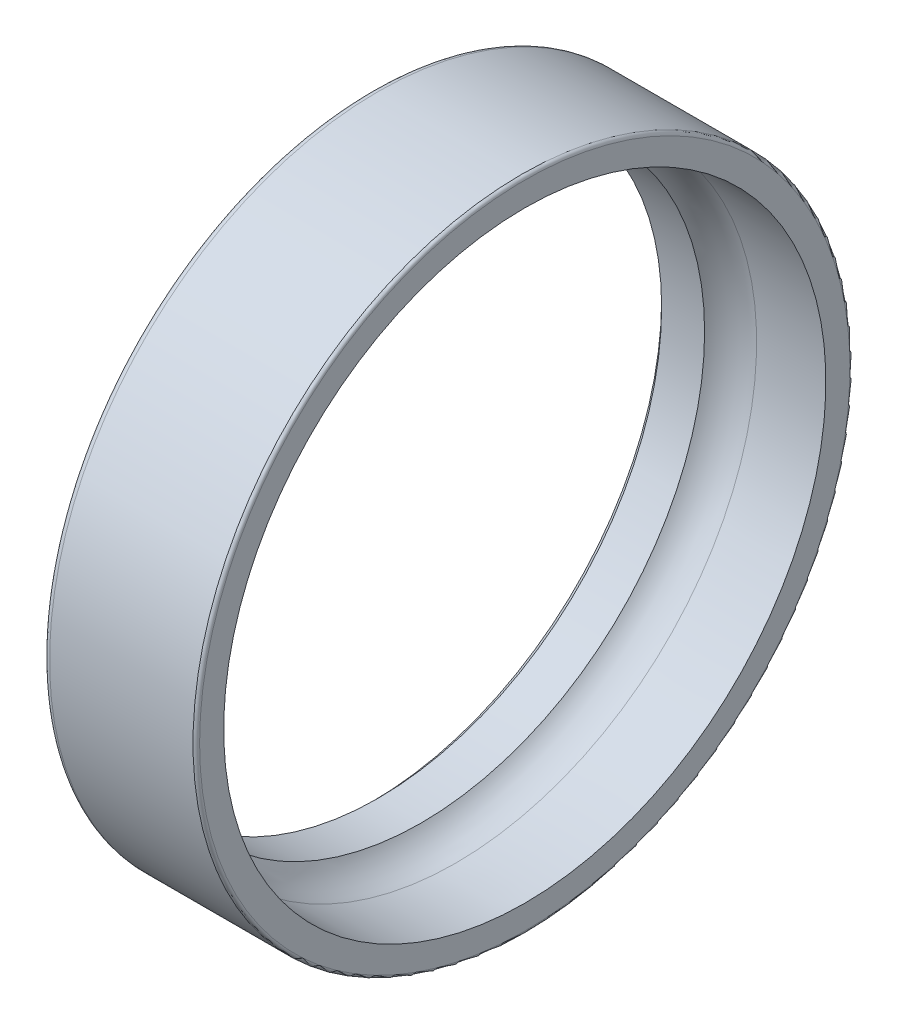
ISO-10303-21;
HEADER;
FILE_DESCRIPTION(('STEP AP214'),'2;1');
FILE_NAME('part.step','',(''),(''),'','','');
FILE_SCHEMA(('AUTOMOTIVE_DESIGN { 1 0 10303 214 1 1 1 1 }'));
ENDSEC;
DATA;
#1=APPLICATION_CONTEXT('core data for automotive mechanical design processes');
#2=APPLICATION_PROTOCOL_DEFINITION('international standard','automotive_design',2000,#1);
#3=PRODUCT_CONTEXT('',#1,'mechanical');
#4=PRODUCT('Part','Part','',(#3));
#5=PRODUCT_RELATED_PRODUCT_CATEGORY('part','',(#4));
#6=PRODUCT_DEFINITION_FORMATION('','',#4);
#7=PRODUCT_DEFINITION_CONTEXT('part definition',#1,'design');
#8=PRODUCT_DEFINITION('design','',#6,#7);
#9=PRODUCT_DEFINITION_SHAPE('','',#8);
#10=(LENGTH_UNIT() NAMED_UNIT(*) SI_UNIT(.MILLI.,.METRE.));
#11=(NAMED_UNIT(*) PLANE_ANGLE_UNIT() SI_UNIT($,.RADIAN.));
#12=(NAMED_UNIT(*) SI_UNIT($,.STERADIAN.) SOLID_ANGLE_UNIT());
#13=UNCERTAINTY_MEASURE_WITH_UNIT(LENGTH_MEASURE(1.E-05),#10,'distance_accuracy_value','');
#14=(GEOMETRIC_REPRESENTATION_CONTEXT(3) GLOBAL_UNCERTAINTY_ASSIGNED_CONTEXT((#13)) GLOBAL_UNIT_ASSIGNED_CONTEXT((#10,
#11,#12)) REPRESENTATION_CONTEXT('',''));
#15=CARTESIAN_POINT('',(0.,0.,0.));
#16=DIRECTION('',(0.,0.,1.));
#17=DIRECTION('',(1.,0.,0.));
#18=AXIS2_PLACEMENT_3D('',#15,#16,#17);
#19=CARTESIAN_POINT('',(0.,13.975,0.));
#20=DIRECTION('',(-1.,0.,0.));
#21=DIRECTION('',(0.,1.,0.));
#22=AXIS2_PLACEMENT_3D('',#19,#20,#21);
#23=PLANE('',#22);
#24=CARTESIAN_POINT('',(0.,0.,0.));
#25=DIRECTION('',(1.,0.,0.));
#26=DIRECTION('',(0.,1.,0.));
#27=AXIS2_PLACEMENT_3D('',#24,#25,#26);
#28=CIRCLE('',#27,13.25);
#29=CARTESIAN_POINT('',(0.,-13.25,0.));
#30=VERTEX_POINT('',#29);
#31=EDGE_CURVE('E90',#30,#30,#28,.T.);
#32=ORIENTED_EDGE('',*,*,#31,.T.);
#33=EDGE_LOOP('',(#32));
#34=FACE_BOUND('',#33,.T.);
#35=CARTESIAN_POINT('',(0.,0.,0.));
#36=DIRECTION('',(1.,0.,0.));
#37=DIRECTION('',(0.,1.,0.));
#38=AXIS2_PLACEMENT_3D('',#35,#36,#37);
#39=CIRCLE('',#38,14.7);
#40=CARTESIAN_POINT('',(0.,0.,14.7));
#41=VERTEX_POINT('',#40);
#42=EDGE_CURVE('E70',#41,#41,#39,.T.);
#43=ORIENTED_EDGE('',*,*,#42,.F.);
#44=EDGE_LOOP('',(#43));
#45=FACE_BOUND('',#44,.T.);
#46=ADVANCED_FACE('F17',(#34,#45),#23,.T.);
#47=CARTESIAN_POINT('',(7.,14.3,0.));
#48=DIRECTION('',(1.,0.,0.));
#49=DIRECTION('',(0.,1.,0.));
#50=AXIS2_PLACEMENT_3D('',#47,#48,#49);
#51=PLANE('',#50);
#52=CARTESIAN_POINT('',(7.,0.,0.));
#53=DIRECTION('',(1.,0.,0.));
#54=DIRECTION('',(0.,1.,0.));
#55=AXIS2_PLACEMENT_3D('',#52,#53,#54);
#56=CIRCLE('',#55,13.75);
#57=CARTESIAN_POINT('',(7.,-13.75,0.));
#58=VERTEX_POINT('',#57);
#59=EDGE_CURVE('E21',#58,#58,#56,.T.);
#60=ORIENTED_EDGE('',*,*,#59,.F.);
#61=EDGE_LOOP('',(#60));
#62=FACE_BOUND('',#61,.T.);
#63=CARTESIAN_POINT('',(7.,0.,0.));
#64=DIRECTION('',(1.,0.,0.));
#65=DIRECTION('',(0.,1.,0.));
#66=AXIS2_PLACEMENT_3D('',#63,#64,#65);
#67=CIRCLE('',#66,14.85);
#68=CARTESIAN_POINT('',(7.,0.,14.85));
#69=VERTEX_POINT('',#68);
#70=EDGE_CURVE('E27',#69,#69,#67,.T.);
#71=ORIENTED_EDGE('',*,*,#70,.T.);
#72=EDGE_LOOP('',(#71));
#73=FACE_BOUND('',#72,.T.);
#74=ADVANCED_FACE('F121',(#62,#73),#51,.T.);
#75=CARTESIAN_POINT('',(3.575,0.,0.));
#76=DIRECTION('',(1.,0.,0.));
#77=DIRECTION('',(0.,1.,0.));
#78=AXIS2_PLACEMENT_3D('',#75,#76,#77);
#79=CYLINDRICAL_SURFACE('',#78,15.);
#80=CARTESIAN_POINT('',(0.3,0.,0.));
#81=DIRECTION('',(1.,0.,0.));
#82=DIRECTION('',(0.,1.,0.));
#83=AXIS2_PLACEMENT_3D('',#80,#81,#82);
#84=CIRCLE('',#83,15.);
#85=CARTESIAN_POINT('',(0.3,-15.,0.));
#86=VERTEX_POINT('',#85);
#87=EDGE_CURVE('E61',#86,#86,#84,.T.);
#88=ORIENTED_EDGE('',*,*,#87,.T.);
#89=EDGE_LOOP('',(#88));
#90=FACE_BOUND('',#89,.T.);
#91=CARTESIAN_POINT('',(6.85,0.,0.));
#92=DIRECTION('',(1.,0.,0.));
#93=DIRECTION('',(0.,1.,0.));
#94=AXIS2_PLACEMENT_3D('',#91,#92,#93);
#95=CIRCLE('',#94,15.);
#96=CARTESIAN_POINT('',(6.85,-15.,0.));
#97=VERTEX_POINT('',#96);
#98=EDGE_CURVE('E11',#97,#97,#95,.T.);
#99=ORIENTED_EDGE('',*,*,#98,.F.);
#100=EDGE_LOOP('',(#99));
#101=FACE_BOUND('',#100,.T.);
#102=ADVANCED_FACE('F127',(#90,#101),#79,.T.);
#103=CARTESIAN_POINT('',(6.85,0.,0.));
#104=DIRECTION('',(1.,0.,0.));
#105=DIRECTION('',(0.,0.,-1.));
#106=AXIS2_PLACEMENT_3D('',#103,#104,#105);
#107=TOROIDAL_SURFACE('',#106,14.85,0.15);
#108=ORIENTED_EDGE('',*,*,#98,.T.);
#109=EDGE_LOOP('',(#108));
#110=FACE_BOUND('',#109,.T.);
#111=ORIENTED_EDGE('',*,*,#70,.F.);
#112=EDGE_LOOP('',(#111));
#113=FACE_BOUND('',#112,.T.);
#114=ADVANCED_FACE('F118',(#110,#113),#107,.T.);
#115=CARTESIAN_POINT('',(5.42245673247465,0.,0.));
#116=DIRECTION('',(1.,0.,0.));
#117=DIRECTION('',(0.,1.,0.));
#118=AXIS2_PLACEMENT_3D('',#115,#116,#117);
#119=CONICAL_SURFACE('',#118,13.7464975544884,0.00222018617740625);
#120=CARTESIAN_POINT('',(3.84491346494929,0.,0.));
#121=DIRECTION('',(1.,0.,0.));
#122=DIRECTION('',(0.,1.,0.));
#123=AXIS2_PLACEMENT_3D('',#120,#121,#122);
#124=CIRCLE('',#123,13.7429951089768);
#125=CARTESIAN_POINT('',(3.84491346494929,13.7429951089768,0.));
#126=VERTEX_POINT('',#125);
#127=EDGE_CURVE('E81',#126,#126,#124,.T.);
#128=ORIENTED_EDGE('',*,*,#127,.F.);
#129=EDGE_LOOP('',(#128));
#130=FACE_BOUND('',#129,.T.);
#131=ORIENTED_EDGE('',*,*,#59,.T.);
#132=EDGE_LOOP('',(#131));
#133=FACE_BOUND('',#132,.T.);
#134=ADVANCED_FACE('F113',(#130,#133),#119,.F.);
#135=CARTESIAN_POINT('',(3.84931942079864,0.,0.));
#136=DIRECTION('',(1.,0.,0.));
#137=DIRECTION('',(0.,0.,-1.));
#138=AXIS2_PLACEMENT_3D('',#135,#136,#137);
#139=TOROIDAL_SURFACE('',#138,11.7585,1.9845);
#140=ORIENTED_EDGE('',*,*,#127,.T.);
#141=EDGE_LOOP('',(#140));
#142=FACE_BOUND('',#141,.T.);
#143=CARTESIAN_POINT('',(2.26231973585853,0.,0.));
#144=DIRECTION('',(1.,0.,0.));
#145=DIRECTION('',(0.,1.,0.));
#146=AXIS2_PLACEMENT_3D('',#143,#144,#145);
#147=CIRCLE('',#146,12.95);
#148=CARTESIAN_POINT('',(2.26231973585853,0.,12.95));
#149=VERTEX_POINT('',#148);
#150=EDGE_CURVE('E85',#149,#149,#147,.T.);
#151=ORIENTED_EDGE('',*,*,#150,.F.);
#152=EDGE_LOOP('',(#151));
#153=FACE_BOUND('',#152,.T.);
#154=ADVANCED_FACE('F19',(#142,#153),#139,.F.);
#155=CARTESIAN_POINT('',(1.28115986792927,0.,0.));
#156=DIRECTION('',(1.,0.,0.));
#157=DIRECTION('',(0.,1.,0.));
#158=AXIS2_PLACEMENT_3D('',#155,#156,#157);
#159=CYLINDRICAL_SURFACE('',#158,12.95);
#160=CARTESIAN_POINT('',(0.3,0.,0.));
#161=DIRECTION('',(1.,0.,0.));
#162=DIRECTION('',(0.,1.,0.));
#163=AXIS2_PLACEMENT_3D('',#160,#161,#162);
#164=CIRCLE('',#163,12.95);
#165=CARTESIAN_POINT('',(0.3,-12.95,0.));
#166=VERTEX_POINT('',#165);
#167=EDGE_CURVE('E94',#166,#166,#164,.T.);
#168=ORIENTED_EDGE('',*,*,#167,.F.);
#169=EDGE_LOOP('',(#168));
#170=FACE_BOUND('',#169,.T.);
#171=ORIENTED_EDGE('',*,*,#150,.T.);
#172=EDGE_LOOP('',(#171));
#173=FACE_BOUND('',#172,.T.);
#174=ADVANCED_FACE('F107',(#170,#173),#159,.F.);
#175=CARTESIAN_POINT('',(0.15,0.,0.));
#176=DIRECTION('',(-1.,0.,0.));
#177=DIRECTION('',(0.,1.,0.));
#178=AXIS2_PLACEMENT_3D('',#175,#176,#177);
#179=CONICAL_SURFACE('',#178,13.1,0.785398163397447);
#180=ORIENTED_EDGE('',*,*,#31,.F.);
#181=EDGE_LOOP('',(#180));
#182=FACE_BOUND('',#181,.T.);
#183=ORIENTED_EDGE('',*,*,#167,.T.);
#184=EDGE_LOOP('',(#183));
#185=FACE_BOUND('',#184,.T.);
#186=ADVANCED_FACE('F105',(#182,#185),#179,.F.);
#187=CARTESIAN_POINT('',(0.3,0.,0.));
#188=DIRECTION('',(1.,0.,0.));
#189=DIRECTION('',(0.,0.,-1.));
#190=AXIS2_PLACEMENT_3D('',#187,#188,#189);
#191=TOROIDAL_SURFACE('',#190,14.7,0.3);
#192=ORIENTED_EDGE('',*,*,#42,.T.);
#193=EDGE_LOOP('',(#192));
#194=FACE_BOUND('',#193,.T.);
#195=ORIENTED_EDGE('',*,*,#87,.F.);
#196=EDGE_LOOP('',(#195));
#197=FACE_BOUND('',#196,.T.);
#198=ADVANCED_FACE('F131',(#194,#197),#191,.T.);
#199=CLOSED_SHELL('',(#46,#74,#102,#114,#134,#154,#174,#186,#198));
#200=MANIFOLD_SOLID_BREP('B1',#199);
#201=ADVANCED_BREP_SHAPE_REPRESENTATION('',(#18,#200),#14);
#202=SHAPE_DEFINITION_REPRESENTATION(#9,#201);
ENDSEC;
END-ISO-10303-21;
